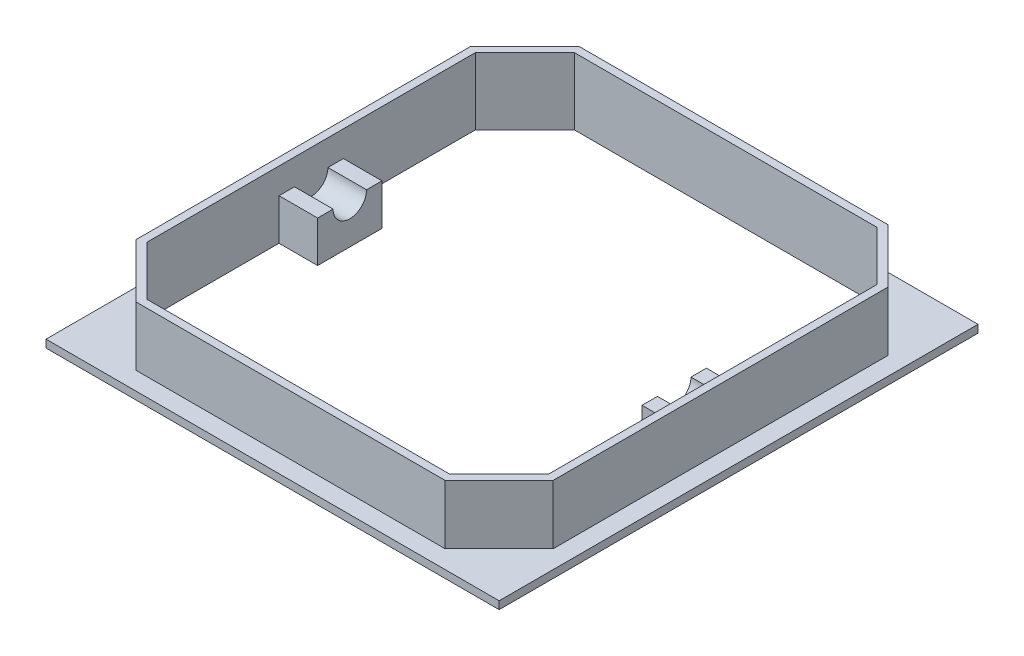
ISO-10303-21;
HEADER;
FILE_DESCRIPTION(('STEP AP214'),'2;1');
FILE_NAME('part.step','',(''),(''),'','','');
FILE_SCHEMA(('AUTOMOTIVE_DESIGN { 1 0 10303 214 1 1 1 1 }'));
ENDSEC;
DATA;
#1=APPLICATION_CONTEXT('core data for automotive mechanical design processes');
#2=APPLICATION_PROTOCOL_DEFINITION('international standard','automotive_design',2000,#1);
#3=PRODUCT_CONTEXT('',#1,'mechanical');
#4=PRODUCT('Part','Part','',(#3));
#5=PRODUCT_RELATED_PRODUCT_CATEGORY('part','',(#4));
#6=PRODUCT_DEFINITION_FORMATION('','',#4);
#7=PRODUCT_DEFINITION_CONTEXT('part definition',#1,'design');
#8=PRODUCT_DEFINITION('design','',#6,#7);
#9=PRODUCT_DEFINITION_SHAPE('','',#8);
#10=(LENGTH_UNIT() NAMED_UNIT(*) SI_UNIT(.MILLI.,.METRE.));
#11=(NAMED_UNIT(*) PLANE_ANGLE_UNIT() SI_UNIT($,.RADIAN.));
#12=(NAMED_UNIT(*) SI_UNIT($,.STERADIAN.) SOLID_ANGLE_UNIT());
#13=UNCERTAINTY_MEASURE_WITH_UNIT(LENGTH_MEASURE(1.E-05),#10,'distance_accuracy_value','');
#14=(GEOMETRIC_REPRESENTATION_CONTEXT(3) GLOBAL_UNCERTAINTY_ASSIGNED_CONTEXT((#13)) GLOBAL_UNIT_ASSIGNED_CONTEXT((#10,
#11,#12)) REPRESENTATION_CONTEXT('',''));
#15=CARTESIAN_POINT('',(0.,0.,0.));
#16=DIRECTION('',(0.,0.,1.));
#17=DIRECTION('',(1.,0.,0.));
#18=AXIS2_PLACEMENT_3D('',#15,#16,#17);
#19=CARTESIAN_POINT('',(-39.,0.,-31.8786796564403));
#20=DIRECTION('',(-1.,0.,0.));
#21=DIRECTION('',(0.,0.,1.));
#22=AXIS2_PLACEMENT_3D('',#19,#20,#21);
#23=PLANE('',#22);
#24=DIRECTION('',(0.,-1.,0.));
#25=VECTOR('',#24,1.);
#26=CARTESIAN_POINT('',(-39.,0.,6.24999999999997));
#27=LINE('',#26,#25);
#28=CARTESIAN_POINT('',(-39.,7.99999999999999,6.25));
#29=VERTEX_POINT('',#28);
#30=CARTESIAN_POINT('',(-39.,0.,6.24999999999997));
#31=VERTEX_POINT('',#30);
#32=EDGE_CURVE('E256',#29,#31,#27,.T.);
#33=ORIENTED_EDGE('',*,*,#32,.F.);
#34=DIRECTION('',(0.,0.,1.));
#35=VECTOR('',#34,1.);
#36=CARTESIAN_POINT('',(-39.,7.99999999999999,6.25));
#37=LINE('',#36,#35);
#38=CARTESIAN_POINT('',(-39.,7.99999999999999,3.25));
#39=VERTEX_POINT('',#38);
#40=EDGE_CURVE('E304',#39,#29,#37,.T.);
#41=ORIENTED_EDGE('',*,*,#40,.F.);
#42=CARTESIAN_POINT('',(-39.,7.99999999999999,0.));
#43=DIRECTION('',(-1.,0.,0.));
#44=DIRECTION('',(0.,0.,-1.));
#45=AXIS2_PLACEMENT_3D('',#42,#43,#44);
#46=CIRCLE('',#45,3.25);
#47=CARTESIAN_POINT('',(-39.,7.99999999999999,-3.25));
#48=VERTEX_POINT('',#47);
#49=EDGE_CURVE('E320',#48,#39,#46,.T.);
#50=ORIENTED_EDGE('',*,*,#49,.F.);
#51=DIRECTION('',(0.,0.,1.));
#52=VECTOR('',#51,1.);
#53=CARTESIAN_POINT('',(-39.,7.99999999999999,-6.25));
#54=LINE('',#53,#52);
#55=CARTESIAN_POINT('',(-39.,7.99999999999999,-6.25));
#56=VERTEX_POINT('',#55);
#57=EDGE_CURVE('E60',#56,#48,#54,.T.);
#58=ORIENTED_EDGE('',*,*,#57,.F.);
#59=DIRECTION('',(0.,1.,0.));
#60=VECTOR('',#59,1.);
#61=CARTESIAN_POINT('',(-39.,0.,-6.25));
#62=LINE('',#61,#60);
#63=CARTESIAN_POINT('',(-39.,0.,-6.25));
#64=VERTEX_POINT('',#63);
#65=EDGE_CURVE('E317',#64,#56,#62,.T.);
#66=ORIENTED_EDGE('',*,*,#65,.F.);
#67=DIRECTION('',(0.,0.,1.));
#68=VECTOR('',#67,1.);
#69=CARTESIAN_POINT('',(-39.,0.,-31.8786796564403));
#70=LINE('',#69,#68);
#71=CARTESIAN_POINT('',(-39.,0.,-31.8786796564403));
#72=VERTEX_POINT('',#71);
#73=EDGE_CURVE('E367',#72,#64,#70,.T.);
#74=ORIENTED_EDGE('',*,*,#73,.F.);
#75=DIRECTION('',(0.,1.,0.));
#76=VECTOR('',#75,1.);
#77=CARTESIAN_POINT('',(-39.,0.,-31.8786796564403));
#78=LINE('',#77,#76);
#79=CARTESIAN_POINT('',(-39.,13.,-31.8786796564403));
#80=VERTEX_POINT('',#79);
#81=EDGE_CURVE('E395',#72,#80,#78,.T.);
#82=ORIENTED_EDGE('',*,*,#81,.T.);
#83=DIRECTION('',(0.,0.,1.));
#84=VECTOR('',#83,1.);
#85=CARTESIAN_POINT('',(-39.,13.,-31.8786796564403));
#86=LINE('',#85,#84);
#87=CARTESIAN_POINT('',(-39.,13.,31.8786796564402));
#88=VERTEX_POINT('',#87);
#89=EDGE_CURVE('E347',#80,#88,#86,.T.);
#90=ORIENTED_EDGE('',*,*,#89,.T.);
#91=DIRECTION('',(0.,1.,0.));
#92=VECTOR('',#91,1.);
#93=CARTESIAN_POINT('',(-39.,0.,31.8786796564402));
#94=LINE('',#93,#92);
#95=CARTESIAN_POINT('',(-39.,0.,31.8786796564402));
#96=VERTEX_POINT('',#95);
#97=EDGE_CURVE('E392',#96,#88,#94,.T.);
#98=ORIENTED_EDGE('',*,*,#97,.F.);
#99=EDGE_CURVE('E366',#31,#96,#70,.T.);
#100=ORIENTED_EDGE('',*,*,#99,.F.);
#101=EDGE_LOOP('',(#33,#41,#50,#58,#66,#74,#82,#90,#98,#100));
#102=FACE_BOUND('',#101,.T.);
#103=ADVANCED_FACE('F37',(#102),#23,.F.);
#104=CARTESIAN_POINT('',(44.,13.,46.5));
#105=DIRECTION('',(-1.,0.,0.));
#106=DIRECTION('',(0.,0.,1.));
#107=AXIS2_PLACEMENT_3D('',#104,#105,#106);
#108=PLANE('',#107);
#109=DIRECTION('',(0.,-1.,0.));
#110=VECTOR('',#109,1.);
#111=CARTESIAN_POINT('',(44.,13.,-46.5));
#112=LINE('',#111,#110);
#113=CARTESIAN_POINT('',(44.,1.5,-46.5));
#114=VERTEX_POINT('',#113);
#115=CARTESIAN_POINT('',(44.,0.,-46.5));
#116=VERTEX_POINT('',#115);
#117=EDGE_CURVE('E12',#114,#116,#112,.T.);
#118=ORIENTED_EDGE('',*,*,#117,.F.);
#119=DIRECTION('',(0.,0.,-1.));
#120=VECTOR('',#119,1.);
#121=CARTESIAN_POINT('',(44.,1.5,-36.5000000000001));
#122=LINE('',#121,#120);
#123=CARTESIAN_POINT('',(44.0000000000002,1.5,46.5));
#124=VERTEX_POINT('',#123);
#125=EDGE_CURVE('E442',#124,#114,#122,.T.);
#126=ORIENTED_EDGE('',*,*,#125,.F.);
#127=DIRECTION('',(0.,-1.,0.));
#128=VECTOR('',#127,1.);
#129=CARTESIAN_POINT('',(44.,13.,46.5));
#130=LINE('',#129,#128);
#131=CARTESIAN_POINT('',(44.,0.,46.5));
#132=VERTEX_POINT('',#131);
#133=EDGE_CURVE('E493',#124,#132,#130,.T.);
#134=ORIENTED_EDGE('',*,*,#133,.T.);
#135=DIRECTION('',(0.,0.,-1.));
#136=VECTOR('',#135,1.);
#137=CARTESIAN_POINT('',(44.,0.,46.5));
#138=LINE('',#137,#136);
#139=EDGE_CURVE('E454',#132,#116,#138,.T.);
#140=ORIENTED_EDGE('',*,*,#139,.T.);
#141=EDGE_LOOP('',(#118,#126,#134,#140));
#142=FACE_BOUND('',#141,.T.);
#143=ADVANCED_FACE('F39',(#142),#108,.F.);
#144=CARTESIAN_POINT('',(-44.,13.,-46.5));
#145=DIRECTION('',(0.,0.,1.));
#146=DIRECTION('',(1.,0.,0.));
#147=AXIS2_PLACEMENT_3D('',#144,#145,#146);
#148=PLANE('',#147);
#149=DIRECTION('',(0.,-1.,0.));
#150=VECTOR('',#149,1.);
#151=CARTESIAN_POINT('',(-44.,13.,-46.5));
#152=LINE('',#151,#150);
#153=CARTESIAN_POINT('',(-44.,1.5,-46.5));
#154=VERTEX_POINT('',#153);
#155=CARTESIAN_POINT('',(-44.,0.,-46.5));
#156=VERTEX_POINT('',#155);
#157=EDGE_CURVE('E45',#154,#156,#152,.T.);
#158=ORIENTED_EDGE('',*,*,#157,.F.);
#159=DIRECTION('',(-1.,0.,0.));
#160=VECTOR('',#159,1.);
#161=CARTESIAN_POINT('',(-44.,1.5,-46.5));
#162=LINE('',#161,#160);
#163=EDGE_CURVE('E444',#114,#154,#162,.T.);
#164=ORIENTED_EDGE('',*,*,#163,.F.);
#165=ORIENTED_EDGE('',*,*,#117,.T.);
#166=DIRECTION('',(-1.,0.,0.));
#167=VECTOR('',#166,1.);
#168=CARTESIAN_POINT('',(-44.,0.,-46.5));
#169=LINE('',#168,#167);
#170=EDGE_CURVE('E484',#116,#156,#169,.T.);
#171=ORIENTED_EDGE('',*,*,#170,.T.);
#172=EDGE_LOOP('',(#158,#164,#165,#171));
#173=FACE_BOUND('',#172,.T.);
#174=ADVANCED_FACE('F506',(#173),#148,.F.);
#175=CARTESIAN_POINT('',(-44.,13.,46.5));
#176=DIRECTION('',(1.,0.,0.));
#177=DIRECTION('',(0.,0.,-1.));
#178=AXIS2_PLACEMENT_3D('',#175,#176,#177);
#179=PLANE('',#178);
#180=DIRECTION('',(0.,-1.,0.));
#181=VECTOR('',#180,1.);
#182=CARTESIAN_POINT('',(-44.,13.,46.5));
#183=LINE('',#182,#181);
#184=CARTESIAN_POINT('',(-44.,1.5,46.5));
#185=VERTEX_POINT('',#184);
#186=CARTESIAN_POINT('',(-44.,0.,46.5));
#187=VERTEX_POINT('',#186);
#188=EDGE_CURVE('E495',#185,#187,#183,.T.);
#189=ORIENTED_EDGE('',*,*,#188,.F.);
#190=DIRECTION('',(0.,0.,1.));
#191=VECTOR('',#190,1.);
#192=CARTESIAN_POINT('',(-44.,1.5,36.5000000000001));
#193=LINE('',#192,#191);
#194=EDGE_CURVE('E468',#154,#185,#193,.T.);
#195=ORIENTED_EDGE('',*,*,#194,.F.);
#196=ORIENTED_EDGE('',*,*,#157,.T.);
#197=DIRECTION('',(0.,0.,1.));
#198=VECTOR('',#197,1.);
#199=CARTESIAN_POINT('',(-44.,0.,46.5));
#200=LINE('',#199,#198);
#201=EDGE_CURVE('E487',#156,#187,#200,.T.);
#202=ORIENTED_EDGE('',*,*,#201,.T.);
#203=EDGE_LOOP('',(#189,#195,#196,#202));
#204=FACE_BOUND('',#203,.T.);
#205=ADVANCED_FACE('F500',(#204),#179,.F.);
#206=CARTESIAN_POINT('',(-44.,13.,46.5));
#207=DIRECTION('',(0.,0.,-1.));
#208=DIRECTION('',(-1.,0.,0.));
#209=AXIS2_PLACEMENT_3D('',#206,#207,#208);
#210=PLANE('',#209);
#211=ORIENTED_EDGE('',*,*,#133,.F.);
#212=DIRECTION('',(1.,0.,0.));
#213=VECTOR('',#212,1.);
#214=CARTESIAN_POINT('',(-44.,1.5,46.5));
#215=LINE('',#214,#213);
#216=EDGE_CURVE('E394',#185,#124,#215,.T.);
#217=ORIENTED_EDGE('',*,*,#216,.F.);
#218=ORIENTED_EDGE('',*,*,#188,.T.);
#219=DIRECTION('',(1.,0.,0.));
#220=VECTOR('',#219,1.);
#221=CARTESIAN_POINT('',(-44.,0.,46.5));
#222=LINE('',#221,#220);
#223=EDGE_CURVE('E490',#187,#132,#222,.T.);
#224=ORIENTED_EDGE('',*,*,#223,.T.);
#225=EDGE_LOOP('',(#211,#217,#218,#224));
#226=FACE_BOUND('',#225,.T.);
#227=ADVANCED_FACE('F513',(#226),#210,.F.);
#228=CARTESIAN_POINT('',(0.,0.,0.));
#229=DIRECTION('',(0.,-1.,0.));
#230=DIRECTION('',(0.,0.,-1.));
#231=AXIS2_PLACEMENT_3D('',#228,#229,#230);
#232=PLANE('',#231);
#233=DIRECTION('',(0.707106781186548,0.,0.707106781186548));
#234=VECTOR('',#233,1.);
#235=CARTESIAN_POINT('',(-39.,0.,31.8786796564402));
#236=LINE('',#235,#234);
#237=CARTESIAN_POINT('',(-29.3786796564402,0.,41.5));
#238=VERTEX_POINT('',#237);
#239=EDGE_CURVE('E343',#96,#238,#236,.T.);
#240=ORIENTED_EDGE('',*,*,#239,.T.);
#241=DIRECTION('',(1.,0.,0.));
#242=VECTOR('',#241,1.);
#243=CARTESIAN_POINT('',(-29.3786796564402,0.,41.5));
#244=LINE('',#243,#242);
#245=CARTESIAN_POINT('',(29.3786796564402,0.,41.5));
#246=VERTEX_POINT('',#245);
#247=EDGE_CURVE('E346',#238,#246,#244,.T.);
#248=ORIENTED_EDGE('',*,*,#247,.T.);
#249=DIRECTION('',(0.707106781186548,0.,-0.707106781186548));
#250=VECTOR('',#249,1.);
#251=CARTESIAN_POINT('',(29.3786796564402,0.,41.5));
#252=LINE('',#251,#250);
#253=CARTESIAN_POINT('',(39.,0.,31.8786796564402));
#254=VERTEX_POINT('',#253);
#255=EDGE_CURVE('E350',#246,#254,#252,.T.);
#256=ORIENTED_EDGE('',*,*,#255,.T.);
#257=DIRECTION('',(0.,0.,-1.));
#258=VECTOR('',#257,1.);
#259=CARTESIAN_POINT('',(39.,0.,31.8786796564402));
#260=LINE('',#259,#258);
#261=CARTESIAN_POINT('',(39.,0.,6.24999999999997));
#262=VERTEX_POINT('',#261);
#263=EDGE_CURVE('E354',#254,#262,#260,.T.);
#264=ORIENTED_EDGE('',*,*,#263,.T.);
#265=DIRECTION('',(1.,0.,0.));
#266=VECTOR('',#265,1.);
#267=CARTESIAN_POINT('',(31.5,0.,6.24999999999997));
#268=LINE('',#267,#266);
#269=CARTESIAN_POINT('',(31.5,0.,6.24999999999997));
#270=VERTEX_POINT('',#269);
#271=EDGE_CURVE('E281',#270,#262,#268,.T.);
#272=ORIENTED_EDGE('',*,*,#271,.F.);
#273=DIRECTION('',(0.,0.,-1.));
#274=VECTOR('',#273,1.);
#275=CARTESIAN_POINT('',(31.5,0.,6.24999999999997));
#276=LINE('',#275,#274);
#277=CARTESIAN_POINT('',(31.5,0.,-6.25));
#278=VERTEX_POINT('',#277);
#279=EDGE_CURVE('E267',#270,#278,#276,.T.);
#280=ORIENTED_EDGE('',*,*,#279,.T.);
#281=DIRECTION('',(1.,0.,0.));
#282=VECTOR('',#281,1.);
#283=CARTESIAN_POINT('',(31.5,0.,-6.25));
#284=LINE('',#283,#282);
#285=CARTESIAN_POINT('',(39.,0.,-6.25));
#286=VERTEX_POINT('',#285);
#287=EDGE_CURVE('E293',#278,#286,#284,.T.);
#288=ORIENTED_EDGE('',*,*,#287,.T.);
#289=CARTESIAN_POINT('',(39.,0.,-31.8786796564403));
#290=VERTEX_POINT('',#289);
#291=EDGE_CURVE('E353',#286,#290,#260,.T.);
#292=ORIENTED_EDGE('',*,*,#291,.T.);
#293=DIRECTION('',(-0.707106781186548,0.,-0.707106781186548));
#294=VECTOR('',#293,1.);
#295=CARTESIAN_POINT('',(39.,0.,-31.8786796564403));
#296=LINE('',#295,#294);
#297=CARTESIAN_POINT('',(29.3786796564402,0.,-41.5000000000001));
#298=VERTEX_POINT('',#297);
#299=EDGE_CURVE('E357',#290,#298,#296,.T.);
#300=ORIENTED_EDGE('',*,*,#299,.T.);
#301=DIRECTION('',(-1.,0.,0.));
#302=VECTOR('',#301,1.);
#303=CARTESIAN_POINT('',(29.3786796564402,0.,-41.5000000000001));
#304=LINE('',#303,#302);
#305=CARTESIAN_POINT('',(-29.3786796564402,0.,-41.5));
#306=VERTEX_POINT('',#305);
#307=EDGE_CURVE('E360',#298,#306,#304,.T.);
#308=ORIENTED_EDGE('',*,*,#307,.T.);
#309=DIRECTION('',(-0.707106781186548,0.,0.707106781186548));
#310=VECTOR('',#309,1.);
#311=CARTESIAN_POINT('',(-29.3786796564402,0.,-41.5));
#312=LINE('',#311,#310);
#313=EDGE_CURVE('E363',#306,#72,#312,.T.);
#314=ORIENTED_EDGE('',*,*,#313,.T.);
#315=ORIENTED_EDGE('',*,*,#73,.T.);
#316=DIRECTION('',(-1.,0.,0.));
#317=VECTOR('',#316,1.);
#318=CARTESIAN_POINT('',(-31.5,0.,-6.25));
#319=LINE('',#318,#317);
#320=CARTESIAN_POINT('',(-31.5,0.,-6.25));
#321=VERTEX_POINT('',#320);
#322=EDGE_CURVE('E336',#321,#64,#319,.T.);
#323=ORIENTED_EDGE('',*,*,#322,.F.);
#324=DIRECTION('',(0.,0.,-1.));
#325=VECTOR('',#324,1.);
#326=CARTESIAN_POINT('',(-31.5,0.,6.24999999999997));
#327=LINE('',#326,#325);
#328=CARTESIAN_POINT('',(-31.5,0.,6.24999999999997));
#329=VERTEX_POINT('',#328);
#330=EDGE_CURVE('E303',#329,#321,#327,.T.);
#331=ORIENTED_EDGE('',*,*,#330,.F.);
#332=DIRECTION('',(-1.,0.,0.));
#333=VECTOR('',#332,1.);
#334=CARTESIAN_POINT('',(-31.5,0.,6.24999999999997));
#335=LINE('',#334,#333);
#336=EDGE_CURVE('E339',#329,#31,#335,.T.);
#337=ORIENTED_EDGE('',*,*,#336,.T.);
#338=ORIENTED_EDGE('',*,*,#99,.T.);
#339=EDGE_LOOP('',(#240,#248,#256,#264,#272,#280,#288,#292,#300,#308,#314,#315,#323,#331,#337,#338));
#340=FACE_BOUND('',#339,.T.);
#341=ORIENTED_EDGE('',*,*,#139,.F.);
#342=ORIENTED_EDGE('',*,*,#223,.F.);
#343=ORIENTED_EDGE('',*,*,#201,.F.);
#344=ORIENTED_EDGE('',*,*,#170,.F.);
#345=EDGE_LOOP('',(#341,#342,#343,#344));
#346=FACE_BOUND('',#345,.T.);
#347=ADVANCED_FACE('F510',(#340,#346),#232,.T.);
#348=CARTESIAN_POINT('',(-29.9999999999999,-128.035151423349,43.));
#349=DIRECTION('',(0.,0.,1.));
#350=DIRECTION('',(1.,0.,0.));
#351=AXIS2_PLACEMENT_3D('',#348,#349,#350);
#352=PLANE('',#351);
#353=DIRECTION('',(1.,0.,0.));
#354=VECTOR('',#353,1.);
#355=CARTESIAN_POINT('',(-29.9999999999999,1.5,43.));
#356=LINE('',#355,#354);
#357=CARTESIAN_POINT('',(-29.9999999999999,1.5,43.));
#358=VERTEX_POINT('',#357);
#359=CARTESIAN_POINT('',(29.9999999999999,1.5,43.));
#360=VERTEX_POINT('',#359);
#361=EDGE_CURVE('E445',#358,#360,#356,.T.);
#362=ORIENTED_EDGE('',*,*,#361,.T.);
#363=DIRECTION('',(0.,1.,0.));
#364=VECTOR('',#363,1.);
#365=CARTESIAN_POINT('',(29.9999999999999,-128.035151423349,43.));
#366=LINE('',#365,#364);
#367=CARTESIAN_POINT('',(29.9999999999999,13.,43.));
#368=VERTEX_POINT('',#367);
#369=EDGE_CURVE('E433',#360,#368,#366,.T.);
#370=ORIENTED_EDGE('',*,*,#369,.T.);
#371=DIRECTION('',(1.,0.,0.));
#372=VECTOR('',#371,1.);
#373=CARTESIAN_POINT('',(-29.9999999999999,13.,43.));
#374=LINE('',#373,#372);
#375=CARTESIAN_POINT('',(-29.9999999999999,13.,43.));
#376=VERTEX_POINT('',#375);
#377=EDGE_CURVE('E438',#376,#368,#374,.T.);
#378=ORIENTED_EDGE('',*,*,#377,.F.);
#379=DIRECTION('',(0.,1.,0.));
#380=VECTOR('',#379,1.);
#381=CARTESIAN_POINT('',(-29.9999999999999,-128.035151423349,43.));
#382=LINE('',#381,#380);
#383=EDGE_CURVE('E441',#358,#376,#382,.T.);
#384=ORIENTED_EDGE('',*,*,#383,.F.);
#385=EDGE_LOOP('',(#362,#370,#378,#384));
#386=FACE_BOUND('',#385,.T.);
#387=ADVANCED_FACE('F590',(#386),#352,.T.);
#388=CARTESIAN_POINT('',(-29.9999999999999,-128.035151423349,43.));
#389=DIRECTION('',(-0.707106781186543,0.,0.707106781186552));
#390=DIRECTION('',(0.707106781186552,0.,0.707106781186543));
#391=AXIS2_PLACEMENT_3D('',#388,#389,#390);
#392=PLANE('',#391);
#393=DIRECTION('',(0.707106781186552,0.,0.707106781186543));
#394=VECTOR('',#393,1.);
#395=CARTESIAN_POINT('',(-29.9999999999999,1.5,43.));
#396=LINE('',#395,#394);
#397=CARTESIAN_POINT('',(-40.5,1.5,32.5));
#398=VERTEX_POINT('',#397);
#399=EDGE_CURVE('E437',#398,#358,#396,.T.);
#400=ORIENTED_EDGE('',*,*,#399,.T.);
#401=ORIENTED_EDGE('',*,*,#383,.T.);
#402=DIRECTION('',(0.707106781186552,0.,0.707106781186543));
#403=VECTOR('',#402,1.);
#404=CARTESIAN_POINT('',(-29.9999999999999,13.,43.));
#405=LINE('',#404,#403);
#406=CARTESIAN_POINT('',(-40.5,13.,32.5));
#407=VERTEX_POINT('',#406);
#408=EDGE_CURVE('E409',#407,#376,#405,.T.);
#409=ORIENTED_EDGE('',*,*,#408,.F.);
#410=DIRECTION('',(0.,1.,0.));
#411=VECTOR('',#410,1.);
#412=CARTESIAN_POINT('',(-40.5,-128.035151423349,32.5));
#413=LINE('',#412,#411);
#414=EDGE_CURVE('E413',#398,#407,#413,.T.);
#415=ORIENTED_EDGE('',*,*,#414,.F.);
#416=EDGE_LOOP('',(#400,#401,#409,#415));
#417=FACE_BOUND('',#416,.T.);
#418=ADVANCED_FACE('F586',(#417),#392,.T.);
#419=CARTESIAN_POINT('',(-40.5,-128.035151423349,32.5));
#420=DIRECTION('',(-1.,0.,0.));
#421=DIRECTION('',(0.,0.,1.));
#422=AXIS2_PLACEMENT_3D('',#419,#420,#421);
#423=PLANE('',#422);
#424=DIRECTION('',(0.,0.,1.));
#425=VECTOR('',#424,1.);
#426=CARTESIAN_POINT('',(-40.5,1.5,32.5));
#427=LINE('',#426,#425);
#428=CARTESIAN_POINT('',(-40.5,1.5,-32.5));
#429=VERTEX_POINT('',#428);
#430=EDGE_CURVE('E451',#429,#398,#427,.T.);
#431=ORIENTED_EDGE('',*,*,#430,.T.);
#432=ORIENTED_EDGE('',*,*,#414,.T.);
#433=DIRECTION('',(0.,0.,1.));
#434=VECTOR('',#433,1.);
#435=CARTESIAN_POINT('',(-40.5,13.,32.5));
#436=LINE('',#435,#434);
#437=CARTESIAN_POINT('',(-40.5,13.,-32.5));
#438=VERTEX_POINT('',#437);
#439=EDGE_CURVE('E414',#438,#407,#436,.T.);
#440=ORIENTED_EDGE('',*,*,#439,.F.);
#441=DIRECTION('',(0.,1.,0.));
#442=VECTOR('',#441,1.);
#443=CARTESIAN_POINT('',(-40.5,-128.035151423349,-32.5));
#444=LINE('',#443,#442);
#445=EDGE_CURVE('E412',#429,#438,#444,.T.);
#446=ORIENTED_EDGE('',*,*,#445,.F.);
#447=EDGE_LOOP('',(#431,#432,#440,#446));
#448=FACE_BOUND('',#447,.T.);
#449=ADVANCED_FACE('F582',(#448),#423,.T.);
#450=CARTESIAN_POINT('',(-29.9999999999999,-128.035151423349,-43.));
#451=DIRECTION('',(-0.707106781186543,0.,-0.707106781186552));
#452=DIRECTION('',(-0.707106781186552,0.,0.707106781186543));
#453=AXIS2_PLACEMENT_3D('',#450,#451,#452);
#454=PLANE('',#453);
#455=DIRECTION('',(-0.707106781186552,0.,0.707106781186543));
#456=VECTOR('',#455,1.);
#457=CARTESIAN_POINT('',(-29.9999999999999,1.5,-43.));
#458=LINE('',#457,#456);
#459=CARTESIAN_POINT('',(-29.9999999999999,1.5,-43.));
#460=VERTEX_POINT('',#459);
#461=EDGE_CURVE('E455',#460,#429,#458,.T.);
#462=ORIENTED_EDGE('',*,*,#461,.T.);
#463=ORIENTED_EDGE('',*,*,#445,.T.);
#464=DIRECTION('',(-0.707106781186552,0.,0.707106781186543));
#465=VECTOR('',#464,1.);
#466=CARTESIAN_POINT('',(-29.9999999999999,13.,-43.));
#467=LINE('',#466,#465);
#468=CARTESIAN_POINT('',(-29.9999999999999,13.,-43.));
#469=VERTEX_POINT('',#468);
#470=EDGE_CURVE('E418',#469,#438,#467,.T.);
#471=ORIENTED_EDGE('',*,*,#470,.F.);
#472=DIRECTION('',(0.,1.,0.));
#473=VECTOR('',#472,1.);
#474=CARTESIAN_POINT('',(-29.9999999999999,-128.035151423349,-43.));
#475=LINE('',#474,#473);
#476=EDGE_CURVE('E417',#460,#469,#475,.T.);
#477=ORIENTED_EDGE('',*,*,#476,.F.);
#478=EDGE_LOOP('',(#462,#463,#471,#477));
#479=FACE_BOUND('',#478,.T.);
#480=ADVANCED_FACE('F578',(#479),#454,.T.);
#481=CARTESIAN_POINT('',(-29.9999999999999,-128.035151423349,-43.));
#482=DIRECTION('',(0.,0.,-1.));
#483=DIRECTION('',(-1.,0.,0.));
#484=AXIS2_PLACEMENT_3D('',#481,#482,#483);
#485=PLANE('',#484);
#486=DIRECTION('',(-1.,0.,0.));
#487=VECTOR('',#486,1.);
#488=CARTESIAN_POINT('',(-29.9999999999999,1.5,-43.));
#489=LINE('',#488,#487);
#490=CARTESIAN_POINT('',(29.9999999999999,1.5,-43.));
#491=VERTEX_POINT('',#490);
#492=EDGE_CURVE('E458',#491,#460,#489,.T.);
#493=ORIENTED_EDGE('',*,*,#492,.T.);
#494=ORIENTED_EDGE('',*,*,#476,.T.);
#495=DIRECTION('',(-1.,0.,0.));
#496=VECTOR('',#495,1.);
#497=CARTESIAN_POINT('',(-29.9999999999999,13.,-43.));
#498=LINE('',#497,#496);
#499=CARTESIAN_POINT('',(29.9999999999999,13.,-43.));
#500=VERTEX_POINT('',#499);
#501=EDGE_CURVE('E422',#500,#469,#498,.T.);
#502=ORIENTED_EDGE('',*,*,#501,.F.);
#503=DIRECTION('',(0.,1.,0.));
#504=VECTOR('',#503,1.);
#505=CARTESIAN_POINT('',(29.9999999999999,-128.035151423349,-43.));
#506=LINE('',#505,#504);
#507=EDGE_CURVE('E421',#491,#500,#506,.T.);
#508=ORIENTED_EDGE('',*,*,#507,.F.);
#509=EDGE_LOOP('',(#493,#494,#502,#508));
#510=FACE_BOUND('',#509,.T.);
#511=ADVANCED_FACE('F574',(#510),#485,.T.);
#512=CARTESIAN_POINT('',(29.9999999999999,-128.035151423349,-43.));
#513=DIRECTION('',(0.707106781186543,0.,-0.707106781186552));
#514=DIRECTION('',(-0.707106781186552,0.,-0.707106781186543));
#515=AXIS2_PLACEMENT_3D('',#512,#513,#514);
#516=PLANE('',#515);
#517=DIRECTION('',(-0.707106781186552,0.,-0.707106781186543));
#518=VECTOR('',#517,1.);
#519=CARTESIAN_POINT('',(29.9999999999999,1.5,-43.));
#520=LINE('',#519,#518);
#521=CARTESIAN_POINT('',(40.5,1.5,-32.5));
#522=VERTEX_POINT('',#521);
#523=EDGE_CURVE('E461',#522,#491,#520,.T.);
#524=ORIENTED_EDGE('',*,*,#523,.T.);
#525=ORIENTED_EDGE('',*,*,#507,.T.);
#526=DIRECTION('',(-0.707106781186552,0.,-0.707106781186543));
#527=VECTOR('',#526,1.);
#528=CARTESIAN_POINT('',(29.9999999999999,13.,-43.));
#529=LINE('',#528,#527);
#530=CARTESIAN_POINT('',(40.5,13.,-32.5));
#531=VERTEX_POINT('',#530);
#532=EDGE_CURVE('E426',#531,#500,#529,.T.);
#533=ORIENTED_EDGE('',*,*,#532,.F.);
#534=DIRECTION('',(0.,1.,0.));
#535=VECTOR('',#534,1.);
#536=CARTESIAN_POINT('',(40.5,-128.035151423349,-32.5));
#537=LINE('',#536,#535);
#538=EDGE_CURVE('E425',#522,#531,#537,.T.);
#539=ORIENTED_EDGE('',*,*,#538,.F.);
#540=EDGE_LOOP('',(#524,#525,#533,#539));
#541=FACE_BOUND('',#540,.T.);
#542=ADVANCED_FACE('F570',(#541),#516,.T.);
#543=CARTESIAN_POINT('',(40.5,-128.035151423349,32.5));
#544=DIRECTION('',(1.,0.,0.));
#545=DIRECTION('',(0.,0.,-1.));
#546=AXIS2_PLACEMENT_3D('',#543,#544,#545);
#547=PLANE('',#546);
#548=DIRECTION('',(0.,0.,-1.));
#549=VECTOR('',#548,1.);
#550=CARTESIAN_POINT('',(40.5,1.5,32.5));
#551=LINE('',#550,#549);
#552=CARTESIAN_POINT('',(40.5,1.5,32.5));
#553=VERTEX_POINT('',#552);
#554=EDGE_CURVE('E464',#553,#522,#551,.T.);
#555=ORIENTED_EDGE('',*,*,#554,.T.);
#556=ORIENTED_EDGE('',*,*,#538,.T.);
#557=DIRECTION('',(0.,0.,-1.));
#558=VECTOR('',#557,1.);
#559=CARTESIAN_POINT('',(40.5,13.,32.5));
#560=LINE('',#559,#558);
#561=CARTESIAN_POINT('',(40.5,13.,32.5));
#562=VERTEX_POINT('',#561);
#563=EDGE_CURVE('E430',#562,#531,#560,.T.);
#564=ORIENTED_EDGE('',*,*,#563,.F.);
#565=DIRECTION('',(0.,1.,0.));
#566=VECTOR('',#565,1.);
#567=CARTESIAN_POINT('',(40.5,-128.035151423349,32.5));
#568=LINE('',#567,#566);
#569=EDGE_CURVE('E429',#553,#562,#568,.T.);
#570=ORIENTED_EDGE('',*,*,#569,.F.);
#571=EDGE_LOOP('',(#555,#556,#564,#570));
#572=FACE_BOUND('',#571,.T.);
#573=ADVANCED_FACE('F566',(#572),#547,.T.);
#574=CARTESIAN_POINT('',(29.9999999999999,-128.035151423349,43.));
#575=DIRECTION('',(0.707106781186544,0.,0.707106781186551));
#576=DIRECTION('',(0.707106781186551,0.,-0.707106781186544));
#577=AXIS2_PLACEMENT_3D('',#574,#575,#576);
#578=PLANE('',#577);
#579=DIRECTION('',(0.707106781186551,0.,-0.707106781186544));
#580=VECTOR('',#579,1.);
#581=CARTESIAN_POINT('',(29.9999999999999,1.5,43.));
#582=LINE('',#581,#580);
#583=EDGE_CURVE('E448',#360,#553,#582,.T.);
#584=ORIENTED_EDGE('',*,*,#583,.T.);
#585=ORIENTED_EDGE('',*,*,#569,.T.);
#586=DIRECTION('',(0.707106781186551,0.,-0.707106781186544));
#587=VECTOR('',#586,1.);
#588=CARTESIAN_POINT('',(29.9999999999999,13.,43.));
#589=LINE('',#588,#587);
#590=EDGE_CURVE('E434',#368,#562,#589,.T.);
#591=ORIENTED_EDGE('',*,*,#590,.F.);
#592=ORIENTED_EDGE('',*,*,#369,.F.);
#593=EDGE_LOOP('',(#584,#585,#591,#592));
#594=FACE_BOUND('',#593,.T.);
#595=ADVANCED_FACE('F563',(#594),#578,.T.);
#596=CARTESIAN_POINT('',(0.,1.5,0.));
#597=DIRECTION('',(0.,-1.,0.));
#598=DIRECTION('',(0.,0.,-1.));
#599=AXIS2_PLACEMENT_3D('',#596,#597,#598);
#600=PLANE('',#599);
#601=ORIENTED_EDGE('',*,*,#216,.T.);
#602=ORIENTED_EDGE('',*,*,#125,.T.);
#603=ORIENTED_EDGE('',*,*,#163,.T.);
#604=ORIENTED_EDGE('',*,*,#194,.T.);
#605=EDGE_LOOP('',(#601,#602,#603,#604));
#606=FACE_BOUND('',#605,.T.);
#607=ORIENTED_EDGE('',*,*,#399,.F.);
#608=ORIENTED_EDGE('',*,*,#430,.F.);
#609=ORIENTED_EDGE('',*,*,#461,.F.);
#610=ORIENTED_EDGE('',*,*,#492,.F.);
#611=ORIENTED_EDGE('',*,*,#523,.F.);
#612=ORIENTED_EDGE('',*,*,#554,.F.);
#613=ORIENTED_EDGE('',*,*,#583,.F.);
#614=ORIENTED_EDGE('',*,*,#361,.F.);
#615=EDGE_LOOP('',(#607,#608,#609,#610,#611,#612,#613,#614));
#616=FACE_BOUND('',#615,.T.);
#617=ADVANCED_FACE('F517',(#606,#616),#600,.F.);
#618=CARTESIAN_POINT('',(0.,13.,0.));
#619=DIRECTION('',(0.,-1.,0.));
#620=DIRECTION('',(0.,0.,-1.));
#621=AXIS2_PLACEMENT_3D('',#618,#619,#620);
#622=PLANE('',#621);
#623=DIRECTION('',(1.,0.,0.));
#624=VECTOR('',#623,1.);
#625=CARTESIAN_POINT('',(-29.3786796564402,13.,41.5));
#626=LINE('',#625,#624);
#627=CARTESIAN_POINT('',(-29.3786796564402,13.,41.5));
#628=VERTEX_POINT('',#627);
#629=CARTESIAN_POINT('',(29.3786796564402,13.,41.5));
#630=VERTEX_POINT('',#629);
#631=EDGE_CURVE('E372',#628,#630,#626,.T.);
#632=ORIENTED_EDGE('',*,*,#631,.F.);
#633=DIRECTION('',(0.707106781186548,0.,0.707106781186548));
#634=VECTOR('',#633,1.);
#635=CARTESIAN_POINT('',(-39.,13.,31.8786796564402));
#636=LINE('',#635,#634);
#637=EDGE_CURVE('E342',#88,#628,#636,.T.);
#638=ORIENTED_EDGE('',*,*,#637,.F.);
#639=ORIENTED_EDGE('',*,*,#89,.F.);
#640=DIRECTION('',(-0.707106781186548,0.,0.707106781186548));
#641=VECTOR('',#640,1.);
#642=CARTESIAN_POINT('',(-29.3786796564402,13.,-41.5));
#643=LINE('',#642,#641);
#644=CARTESIAN_POINT('',(-29.3786796564402,13.,-41.5));
#645=VERTEX_POINT('',#644);
#646=EDGE_CURVE('E387',#645,#80,#643,.T.);
#647=ORIENTED_EDGE('',*,*,#646,.F.);
#648=DIRECTION('',(-1.,0.,0.));
#649=VECTOR('',#648,1.);
#650=CARTESIAN_POINT('',(29.3786796564402,13.,-41.5000000000001));
#651=LINE('',#650,#649);
#652=CARTESIAN_POINT('',(29.3786796564402,13.,-41.5000000000001));
#653=VERTEX_POINT('',#652);
#654=EDGE_CURVE('E384',#653,#645,#651,.T.);
#655=ORIENTED_EDGE('',*,*,#654,.F.);
#656=DIRECTION('',(-0.707106781186548,0.,-0.707106781186548));
#657=VECTOR('',#656,1.);
#658=CARTESIAN_POINT('',(39.,13.,-31.8786796564403));
#659=LINE('',#658,#657);
#660=CARTESIAN_POINT('',(39.,13.,-31.8786796564403));
#661=VERTEX_POINT('',#660);
#662=EDGE_CURVE('E381',#661,#653,#659,.T.);
#663=ORIENTED_EDGE('',*,*,#662,.F.);
#664=DIRECTION('',(0.,0.,-1.));
#665=VECTOR('',#664,1.);
#666=CARTESIAN_POINT('',(39.,13.,31.8786796564402));
#667=LINE('',#666,#665);
#668=CARTESIAN_POINT('',(39.,13.,31.8786796564402));
#669=VERTEX_POINT('',#668);
#670=EDGE_CURVE('E378',#669,#661,#667,.T.);
#671=ORIENTED_EDGE('',*,*,#670,.F.);
#672=DIRECTION('',(0.707106781186548,0.,-0.707106781186548));
#673=VECTOR('',#672,1.);
#674=CARTESIAN_POINT('',(29.3786796564402,13.,41.5));
#675=LINE('',#674,#673);
#676=EDGE_CURVE('E375',#630,#669,#675,.T.);
#677=ORIENTED_EDGE('',*,*,#676,.F.);
#678=EDGE_LOOP('',(#632,#638,#639,#647,#655,#663,#671,#677));
#679=FACE_BOUND('',#678,.T.);
#680=ORIENTED_EDGE('',*,*,#377,.T.);
#681=ORIENTED_EDGE('',*,*,#590,.T.);
#682=ORIENTED_EDGE('',*,*,#563,.T.);
#683=ORIENTED_EDGE('',*,*,#532,.T.);
#684=ORIENTED_EDGE('',*,*,#501,.T.);
#685=ORIENTED_EDGE('',*,*,#470,.T.);
#686=ORIENTED_EDGE('',*,*,#439,.T.);
#687=ORIENTED_EDGE('',*,*,#408,.T.);
#688=EDGE_LOOP('',(#680,#681,#682,#683,#684,#685,#686,#687));
#689=FACE_BOUND('',#688,.T.);
#690=ADVANCED_FACE('F561',(#679,#689),#622,.F.);
#691=CARTESIAN_POINT('',(-39.,0.,31.8786796564402));
#692=DIRECTION('',(-0.707106781186548,0.,0.707106781186548));
#693=DIRECTION('',(0.707106781186548,0.,0.707106781186548));
#694=AXIS2_PLACEMENT_3D('',#691,#692,#693);
#695=PLANE('',#694);
#696=ORIENTED_EDGE('',*,*,#637,.T.);
#697=DIRECTION('',(0.,1.,0.));
#698=VECTOR('',#697,1.);
#699=CARTESIAN_POINT('',(-29.3786796564402,0.,41.5));
#700=LINE('',#699,#698);
#701=EDGE_CURVE('E370',#238,#628,#700,.T.);
#702=ORIENTED_EDGE('',*,*,#701,.F.);
#703=ORIENTED_EDGE('',*,*,#239,.F.);
#704=ORIENTED_EDGE('',*,*,#97,.T.);
#705=EDGE_LOOP('',(#696,#702,#703,#704));
#706=FACE_BOUND('',#705,.T.);
#707=ADVANCED_FACE('F538',(#706),#695,.F.);
#708=CARTESIAN_POINT('',(-29.3786796564402,0.,-41.5));
#709=DIRECTION('',(-0.707106781186548,0.,-0.707106781186548));
#710=DIRECTION('',(-0.707106781186548,0.,0.707106781186548));
#711=AXIS2_PLACEMENT_3D('',#708,#709,#710);
#712=PLANE('',#711);
#713=ORIENTED_EDGE('',*,*,#646,.T.);
#714=ORIENTED_EDGE('',*,*,#81,.F.);
#715=ORIENTED_EDGE('',*,*,#313,.F.);
#716=DIRECTION('',(0.,1.,0.));
#717=VECTOR('',#716,1.);
#718=CARTESIAN_POINT('',(-29.3786796564402,0.,-41.5));
#719=LINE('',#718,#717);
#720=EDGE_CURVE('E397',#306,#645,#719,.T.);
#721=ORIENTED_EDGE('',*,*,#720,.T.);
#722=EDGE_LOOP('',(#713,#714,#715,#721));
#723=FACE_BOUND('',#722,.T.);
#724=ADVANCED_FACE('F534',(#723),#712,.F.);
#725=CARTESIAN_POINT('',(29.3786796564402,0.,-41.5000000000001));
#726=DIRECTION('',(0.,0.,-1.));
#727=DIRECTION('',(-1.,0.,0.));
#728=AXIS2_PLACEMENT_3D('',#725,#726,#727);
#729=PLANE('',#728);
#730=ORIENTED_EDGE('',*,*,#654,.T.);
#731=ORIENTED_EDGE('',*,*,#720,.F.);
#732=ORIENTED_EDGE('',*,*,#307,.F.);
#733=DIRECTION('',(0.,1.,0.));
#734=VECTOR('',#733,1.);
#735=CARTESIAN_POINT('',(29.3786796564402,0.,-41.5000000000001));
#736=LINE('',#735,#734);
#737=EDGE_CURVE('E399',#298,#653,#736,.T.);
#738=ORIENTED_EDGE('',*,*,#737,.T.);
#739=EDGE_LOOP('',(#730,#731,#732,#738));
#740=FACE_BOUND('',#739,.T.);
#741=ADVANCED_FACE('F537',(#740),#729,.F.);
#742=CARTESIAN_POINT('',(39.,0.,-31.8786796564403));
#743=DIRECTION('',(0.707106781186548,0.,-0.707106781186548));
#744=DIRECTION('',(-0.707106781186548,0.,-0.707106781186548));
#745=AXIS2_PLACEMENT_3D('',#742,#743,#744);
#746=PLANE('',#745);
#747=ORIENTED_EDGE('',*,*,#662,.T.);
#748=ORIENTED_EDGE('',*,*,#737,.F.);
#749=ORIENTED_EDGE('',*,*,#299,.F.);
#750=DIRECTION('',(0.,1.,0.));
#751=VECTOR('',#750,1.);
#752=CARTESIAN_POINT('',(39.,0.,-31.8786796564403));
#753=LINE('',#752,#751);
#754=EDGE_CURVE('E401',#290,#661,#753,.T.);
#755=ORIENTED_EDGE('',*,*,#754,.T.);
#756=EDGE_LOOP('',(#747,#748,#749,#755));
#757=FACE_BOUND('',#756,.T.);
#758=ADVANCED_FACE('F542',(#757),#746,.F.);
#759=CARTESIAN_POINT('',(39.,0.,31.8786796564402));
#760=DIRECTION('',(1.,0.,0.));
#761=DIRECTION('',(0.,0.,-1.));
#762=AXIS2_PLACEMENT_3D('',#759,#760,#761);
#763=PLANE('',#762);
#764=DIRECTION('',(0.,0.,1.));
#765=VECTOR('',#764,1.);
#766=CARTESIAN_POINT('',(39.,7.99999999999999,6.25));
#767=LINE('',#766,#765);
#768=CARTESIAN_POINT('',(39.,7.99999999999999,3.25));
#769=VERTEX_POINT('',#768);
#770=CARTESIAN_POINT('',(39.,7.99999999999999,6.25));
#771=VERTEX_POINT('',#770);
#772=EDGE_CURVE('E283',#769,#771,#767,.T.);
#773=ORIENTED_EDGE('',*,*,#772,.T.);
#774=DIRECTION('',(0.,-1.,0.));
#775=VECTOR('',#774,1.);
#776=CARTESIAN_POINT('',(39.,0.,6.24999999999997));
#777=LINE('',#776,#775);
#778=EDGE_CURVE('E251',#771,#262,#777,.T.);
#779=ORIENTED_EDGE('',*,*,#778,.T.);
#780=ORIENTED_EDGE('',*,*,#263,.F.);
#781=DIRECTION('',(0.,1.,0.));
#782=VECTOR('',#781,1.);
#783=CARTESIAN_POINT('',(39.,0.,31.8786796564402));
#784=LINE('',#783,#782);
#785=EDGE_CURVE('E403',#254,#669,#784,.T.);
#786=ORIENTED_EDGE('',*,*,#785,.T.);
#787=ORIENTED_EDGE('',*,*,#670,.T.);
#788=ORIENTED_EDGE('',*,*,#754,.F.);
#789=ORIENTED_EDGE('',*,*,#291,.F.);
#790=DIRECTION('',(0.,1.,0.));
#791=VECTOR('',#790,1.);
#792=CARTESIAN_POINT('',(39.,0.,-6.25));
#793=LINE('',#792,#791);
#794=CARTESIAN_POINT('',(39.,7.99999999999999,-6.25));
#795=VERTEX_POINT('',#794);
#796=EDGE_CURVE('E52',#286,#795,#793,.T.);
#797=ORIENTED_EDGE('',*,*,#796,.T.);
#798=DIRECTION('',(0.,0.,1.));
#799=VECTOR('',#798,1.);
#800=CARTESIAN_POINT('',(39.,7.99999999999999,-6.25));
#801=LINE('',#800,#799);
#802=CARTESIAN_POINT('',(39.,7.99999999999999,-3.25));
#803=VERTEX_POINT('',#802);
#804=EDGE_CURVE('E288',#795,#803,#801,.T.);
#805=ORIENTED_EDGE('',*,*,#804,.T.);
#806=CARTESIAN_POINT('',(39.,7.99999999999999,0.));
#807=DIRECTION('',(-1.,0.,0.));
#808=DIRECTION('',(0.,0.,-1.));
#809=AXIS2_PLACEMENT_3D('',#806,#807,#808);
#810=CIRCLE('',#809,3.25);
#811=EDGE_CURVE('E285',#803,#769,#810,.T.);
#812=ORIENTED_EDGE('',*,*,#811,.T.);
#813=EDGE_LOOP('',(#773,#779,#780,#786,#787,#788,#789,#797,#805,#812));
#814=FACE_BOUND('',#813,.T.);
#815=ADVANCED_FACE('F546',(#814),#763,.F.);
#816=CARTESIAN_POINT('',(29.3786796564402,0.,41.5));
#817=DIRECTION('',(0.707106781186548,0.,0.707106781186548));
#818=DIRECTION('',(0.707106781186548,0.,-0.707106781186548));
#819=AXIS2_PLACEMENT_3D('',#816,#817,#818);
#820=PLANE('',#819);
#821=ORIENTED_EDGE('',*,*,#676,.T.);
#822=ORIENTED_EDGE('',*,*,#785,.F.);
#823=ORIENTED_EDGE('',*,*,#255,.F.);
#824=DIRECTION('',(0.,1.,0.));
#825=VECTOR('',#824,1.);
#826=CARTESIAN_POINT('',(29.3786796564402,0.,41.5));
#827=LINE('',#826,#825);
#828=EDGE_CURVE('E405',#246,#630,#827,.T.);
#829=ORIENTED_EDGE('',*,*,#828,.T.);
#830=EDGE_LOOP('',(#821,#822,#823,#829));
#831=FACE_BOUND('',#830,.T.);
#832=ADVANCED_FACE('F550',(#831),#820,.F.);
#833=CARTESIAN_POINT('',(-29.3786796564402,0.,41.5));
#834=DIRECTION('',(0.,0.,1.));
#835=DIRECTION('',(1.,0.,0.));
#836=AXIS2_PLACEMENT_3D('',#833,#834,#835);
#837=PLANE('',#836);
#838=ORIENTED_EDGE('',*,*,#631,.T.);
#839=ORIENTED_EDGE('',*,*,#828,.F.);
#840=ORIENTED_EDGE('',*,*,#247,.F.);
#841=ORIENTED_EDGE('',*,*,#701,.T.);
#842=EDGE_LOOP('',(#838,#839,#840,#841));
#843=FACE_BOUND('',#842,.T.);
#844=ADVANCED_FACE('F554',(#843),#837,.F.);
#845=CARTESIAN_POINT('',(-31.5,0.,6.24999999999997));
#846=DIRECTION('',(0.,0.,-1.));
#847=DIRECTION('',(0.,1.,0.));
#848=AXIS2_PLACEMENT_3D('',#845,#846,#847);
#849=PLANE('',#848);
#850=ORIENTED_EDGE('',*,*,#32,.T.);
#851=ORIENTED_EDGE('',*,*,#336,.F.);
#852=DIRECTION('',(0.,-1.,0.));
#853=VECTOR('',#852,1.);
#854=CARTESIAN_POINT('',(-31.5,0.,6.24999999999997));
#855=LINE('',#854,#853);
#856=CARTESIAN_POINT('',(-31.5,7.99999999999999,6.25));
#857=VERTEX_POINT('',#856);
#858=EDGE_CURVE('E300',#857,#329,#855,.T.);
#859=ORIENTED_EDGE('',*,*,#858,.F.);
#860=DIRECTION('',(-1.,0.,0.));
#861=VECTOR('',#860,1.);
#862=CARTESIAN_POINT('',(-31.5,7.99999999999999,6.25));
#863=LINE('',#862,#861);
#864=EDGE_CURVE('E314',#857,#29,#863,.T.);
#865=ORIENTED_EDGE('',*,*,#864,.T.);
#866=EDGE_LOOP('',(#850,#851,#859,#865));
#867=FACE_BOUND('',#866,.T.);
#868=ADVANCED_FACE('F532',(#867),#849,.F.);
#869=CARTESIAN_POINT('',(-31.5,0.,-6.25));
#870=DIRECTION('',(0.,0.,1.));
#871=DIRECTION('',(1.,0.,0.));
#872=AXIS2_PLACEMENT_3D('',#869,#870,#871);
#873=PLANE('',#872);
#874=ORIENTED_EDGE('',*,*,#65,.T.);
#875=DIRECTION('',(-1.,0.,0.));
#876=VECTOR('',#875,1.);
#877=CARTESIAN_POINT('',(-31.5,7.99999999999999,-6.25));
#878=LINE('',#877,#876);
#879=CARTESIAN_POINT('',(-31.5,7.99999999999999,-6.25));
#880=VERTEX_POINT('',#879);
#881=EDGE_CURVE('E333',#880,#56,#878,.T.);
#882=ORIENTED_EDGE('',*,*,#881,.F.);
#883=DIRECTION('',(0.,1.,0.));
#884=VECTOR('',#883,1.);
#885=CARTESIAN_POINT('',(-31.5,0.,-6.25));
#886=LINE('',#885,#884);
#887=EDGE_CURVE('E306',#321,#880,#886,.T.);
#888=ORIENTED_EDGE('',*,*,#887,.F.);
#889=ORIENTED_EDGE('',*,*,#322,.T.);
#890=EDGE_LOOP('',(#874,#882,#888,#889));
#891=FACE_BOUND('',#890,.T.);
#892=ADVANCED_FACE('F699',(#891),#873,.F.);
#893=CARTESIAN_POINT('',(-31.5,7.99999999999999,-6.25));
#894=DIRECTION('',(0.,-1.,0.));
#895=DIRECTION('',(0.,0.,-1.));
#896=AXIS2_PLACEMENT_3D('',#893,#894,#895);
#897=PLANE('',#896);
#898=ORIENTED_EDGE('',*,*,#57,.T.);
#899=DIRECTION('',(-1.,0.,0.));
#900=VECTOR('',#899,1.);
#901=CARTESIAN_POINT('',(-31.5,7.99999999999999,-3.25));
#902=LINE('',#901,#900);
#903=CARTESIAN_POINT('',(-31.5,7.99999999999999,-3.25));
#904=VERTEX_POINT('',#903);
#905=EDGE_CURVE('E330',#904,#48,#902,.T.);
#906=ORIENTED_EDGE('',*,*,#905,.F.);
#907=DIRECTION('',(0.,0.,1.));
#908=VECTOR('',#907,1.);
#909=CARTESIAN_POINT('',(-31.5,7.99999999999999,-6.25));
#910=LINE('',#909,#908);
#911=EDGE_CURVE('E308',#880,#904,#910,.T.);
#912=ORIENTED_EDGE('',*,*,#911,.F.);
#913=ORIENTED_EDGE('',*,*,#881,.T.);
#914=EDGE_LOOP('',(#898,#906,#912,#913));
#915=FACE_BOUND('',#914,.T.);
#916=ADVANCED_FACE('F706',(#915),#897,.F.);
#917=CARTESIAN_POINT('',(-31.5,7.99999999999999,0.));
#918=DIRECTION('',(-1.,0.,0.));
#919=DIRECTION('',(0.,0.,1.));
#920=AXIS2_PLACEMENT_3D('',#917,#918,#919);
#921=CYLINDRICAL_SURFACE('',#920,3.25);
#922=ORIENTED_EDGE('',*,*,#49,.T.);
#923=DIRECTION('',(-1.,0.,0.));
#924=VECTOR('',#923,1.);
#925=CARTESIAN_POINT('',(-31.5,7.99999999999999,3.25));
#926=LINE('',#925,#924);
#927=CARTESIAN_POINT('',(-31.5,7.99999999999999,3.25));
#928=VERTEX_POINT('',#927);
#929=EDGE_CURVE('E327',#928,#39,#926,.T.);
#930=ORIENTED_EDGE('',*,*,#929,.F.);
#931=CARTESIAN_POINT('',(-31.5,7.99999999999999,0.));
#932=DIRECTION('',(-1.,0.,0.));
#933=DIRECTION('',(0.,0.,-1.));
#934=AXIS2_PLACEMENT_3D('',#931,#932,#933);
#935=CIRCLE('',#934,3.25);
#936=EDGE_CURVE('E310',#904,#928,#935,.T.);
#937=ORIENTED_EDGE('',*,*,#936,.F.);
#938=ORIENTED_EDGE('',*,*,#905,.T.);
#939=EDGE_LOOP('',(#922,#930,#937,#938));
#940=FACE_BOUND('',#939,.T.);
#941=ADVANCED_FACE('F713',(#940),#921,.F.);
#942=CARTESIAN_POINT('',(-31.5,7.99999999999999,6.25));
#943=DIRECTION('',(0.,-1.,0.));
#944=DIRECTION('',(0.,0.,-1.));
#945=AXIS2_PLACEMENT_3D('',#942,#943,#944);
#946=PLANE('',#945);
#947=ORIENTED_EDGE('',*,*,#40,.T.);
#948=ORIENTED_EDGE('',*,*,#864,.F.);
#949=DIRECTION('',(0.,0.,1.));
#950=VECTOR('',#949,1.);
#951=CARTESIAN_POINT('',(-31.5,7.99999999999999,6.25));
#952=LINE('',#951,#950);
#953=EDGE_CURVE('E312',#928,#857,#952,.T.);
#954=ORIENTED_EDGE('',*,*,#953,.F.);
#955=ORIENTED_EDGE('',*,*,#929,.T.);
#956=EDGE_LOOP('',(#947,#948,#954,#955));
#957=FACE_BOUND('',#956,.T.);
#958=ADVANCED_FACE('F721',(#957),#946,.F.);
#959=CARTESIAN_POINT('',(-31.5,7.99999999999999,0.));
#960=DIRECTION('',(1.,0.,0.));
#961=DIRECTION('',(0.,0.,-1.));
#962=AXIS2_PLACEMENT_3D('',#959,#960,#961);
#963=PLANE('',#962);
#964=ORIENTED_EDGE('',*,*,#858,.T.);
#965=ORIENTED_EDGE('',*,*,#330,.T.);
#966=ORIENTED_EDGE('',*,*,#887,.T.);
#967=ORIENTED_EDGE('',*,*,#911,.T.);
#968=ORIENTED_EDGE('',*,*,#936,.T.);
#969=ORIENTED_EDGE('',*,*,#953,.T.);
#970=EDGE_LOOP('',(#964,#965,#966,#967,#968,#969));
#971=FACE_BOUND('',#970,.T.);
#972=ADVANCED_FACE('F729',(#971),#963,.T.);
#973=CARTESIAN_POINT('',(31.5,0.,6.24999999999997));
#974=DIRECTION('',(0.,0.,1.));
#975=DIRECTION('',(0.,-1.,0.));
#976=AXIS2_PLACEMENT_3D('',#973,#974,#975);
#977=PLANE('',#976);
#978=ORIENTED_EDGE('',*,*,#778,.F.);
#979=DIRECTION('',(1.,0.,0.));
#980=VECTOR('',#979,1.);
#981=CARTESIAN_POINT('',(31.5,7.99999999999999,6.25));
#982=LINE('',#981,#980);
#983=CARTESIAN_POINT('',(31.5,7.99999999999999,6.25));
#984=VERTEX_POINT('',#983);
#985=EDGE_CURVE('E245',#984,#771,#982,.T.);
#986=ORIENTED_EDGE('',*,*,#985,.F.);
#987=DIRECTION('',(0.,-1.,0.));
#988=VECTOR('',#987,1.);
#989=CARTESIAN_POINT('',(31.5,0.,6.24999999999997));
#990=LINE('',#989,#988);
#991=EDGE_CURVE('E248',#984,#270,#990,.T.);
#992=ORIENTED_EDGE('',*,*,#991,.T.);
#993=ORIENTED_EDGE('',*,*,#271,.T.);
#994=EDGE_LOOP('',(#978,#986,#992,#993));
#995=FACE_BOUND('',#994,.T.);
#996=ADVANCED_FACE('F247',(#995),#977,.T.);
#997=CARTESIAN_POINT('',(31.5,7.99999999999999,6.25));
#998=DIRECTION('',(0.,1.,0.));
#999=DIRECTION('',(0.,0.,1.));
#1000=AXIS2_PLACEMENT_3D('',#997,#998,#999);
#1001=PLANE('',#1000);
#1002=ORIENTED_EDGE('',*,*,#772,.F.);
#1003=DIRECTION('',(1.,0.,0.));
#1004=VECTOR('',#1003,1.);
#1005=CARTESIAN_POINT('',(31.5,7.99999999999999,3.25));
#1006=LINE('',#1005,#1004);
#1007=CARTESIAN_POINT('',(31.5,7.99999999999999,3.25));
#1008=VERTEX_POINT('',#1007);
#1009=EDGE_CURVE('E257',#1008,#769,#1006,.T.);
#1010=ORIENTED_EDGE('',*,*,#1009,.F.);
#1011=DIRECTION('',(0.,0.,1.));
#1012=VECTOR('',#1011,1.);
#1013=CARTESIAN_POINT('',(31.5,7.99999999999999,6.25));
#1014=LINE('',#1013,#1012);
#1015=EDGE_CURVE('E263',#1008,#984,#1014,.T.);
#1016=ORIENTED_EDGE('',*,*,#1015,.T.);
#1017=ORIENTED_EDGE('',*,*,#985,.T.);
#1018=EDGE_LOOP('',(#1002,#1010,#1016,#1017));
#1019=FACE_BOUND('',#1018,.T.);
#1020=ADVANCED_FACE('F269',(#1019),#1001,.T.);
#1021=CARTESIAN_POINT('',(31.5,7.99999999999999,0.));
#1022=DIRECTION('',(1.,0.,0.));
#1023=DIRECTION('',(0.,0.,-1.));
#1024=AXIS2_PLACEMENT_3D('',#1021,#1022,#1023);
#1025=CYLINDRICAL_SURFACE('',#1024,3.25);
#1026=ORIENTED_EDGE('',*,*,#811,.F.);
#1027=DIRECTION('',(1.,0.,0.));
#1028=VECTOR('',#1027,1.);
#1029=CARTESIAN_POINT('',(31.5,7.99999999999999,-3.25));
#1030=LINE('',#1029,#1028);
#1031=CARTESIAN_POINT('',(31.5,7.99999999999999,-3.25));
#1032=VERTEX_POINT('',#1031);
#1033=EDGE_CURVE('E297',#1032,#803,#1030,.T.);
#1034=ORIENTED_EDGE('',*,*,#1033,.F.);
#1035=CARTESIAN_POINT('',(31.5,7.99999999999999,0.));
#1036=DIRECTION('',(-1.,0.,0.));
#1037=DIRECTION('',(0.,0.,-1.));
#1038=AXIS2_PLACEMENT_3D('',#1035,#1036,#1037);
#1039=CIRCLE('',#1038,3.25);
#1040=EDGE_CURVE('E270',#1032,#1008,#1039,.T.);
#1041=ORIENTED_EDGE('',*,*,#1040,.T.);
#1042=ORIENTED_EDGE('',*,*,#1009,.T.);
#1043=EDGE_LOOP('',(#1026,#1034,#1041,#1042));
#1044=FACE_BOUND('',#1043,.T.);
#1045=ADVANCED_FACE('F748',(#1044),#1025,.F.);
#1046=CARTESIAN_POINT('',(31.5,7.99999999999999,-6.25));
#1047=DIRECTION('',(0.,1.,0.));
#1048=DIRECTION('',(0.,0.,1.));
#1049=AXIS2_PLACEMENT_3D('',#1046,#1047,#1048);
#1050=PLANE('',#1049);
#1051=ORIENTED_EDGE('',*,*,#804,.F.);
#1052=DIRECTION('',(1.,0.,0.));
#1053=VECTOR('',#1052,1.);
#1054=CARTESIAN_POINT('',(31.5,7.99999999999999,-6.25));
#1055=LINE('',#1054,#1053);
#1056=CARTESIAN_POINT('',(31.5,7.99999999999999,-6.25));
#1057=VERTEX_POINT('',#1056);
#1058=EDGE_CURVE('E295',#1057,#795,#1055,.T.);
#1059=ORIENTED_EDGE('',*,*,#1058,.F.);
#1060=DIRECTION('',(0.,0.,1.));
#1061=VECTOR('',#1060,1.);
#1062=CARTESIAN_POINT('',(31.5,7.99999999999999,-6.25));
#1063=LINE('',#1062,#1061);
#1064=EDGE_CURVE('E272',#1057,#1032,#1063,.T.);
#1065=ORIENTED_EDGE('',*,*,#1064,.T.);
#1066=ORIENTED_EDGE('',*,*,#1033,.T.);
#1067=EDGE_LOOP('',(#1051,#1059,#1065,#1066));
#1068=FACE_BOUND('',#1067,.T.);
#1069=ADVANCED_FACE('F755',(#1068),#1050,.T.);
#1070=CARTESIAN_POINT('',(31.5,0.,-6.25));
#1071=DIRECTION('',(0.,0.,-1.));
#1072=DIRECTION('',(-1.,0.,0.));
#1073=AXIS2_PLACEMENT_3D('',#1070,#1071,#1072);
#1074=PLANE('',#1073);
#1075=ORIENTED_EDGE('',*,*,#796,.F.);
#1076=ORIENTED_EDGE('',*,*,#287,.F.);
#1077=DIRECTION('',(0.,1.,0.));
#1078=VECTOR('',#1077,1.);
#1079=CARTESIAN_POINT('',(31.5,0.,-6.25));
#1080=LINE('',#1079,#1078);
#1081=EDGE_CURVE('E277',#278,#1057,#1080,.T.);
#1082=ORIENTED_EDGE('',*,*,#1081,.T.);
#1083=ORIENTED_EDGE('',*,*,#1058,.T.);
#1084=EDGE_LOOP('',(#1075,#1076,#1082,#1083));
#1085=FACE_BOUND('',#1084,.T.);
#1086=ADVANCED_FACE('F763',(#1085),#1074,.T.);
#1087=CARTESIAN_POINT('',(31.5,7.99999999999999,0.));
#1088=DIRECTION('',(-1.,0.,0.));
#1089=DIRECTION('',(0.,0.,-1.));
#1090=AXIS2_PLACEMENT_3D('',#1087,#1088,#1089);
#1091=PLANE('',#1090);
#1092=ORIENTED_EDGE('',*,*,#991,.F.);
#1093=ORIENTED_EDGE('',*,*,#1015,.F.);
#1094=ORIENTED_EDGE('',*,*,#1040,.F.);
#1095=ORIENTED_EDGE('',*,*,#1064,.F.);
#1096=ORIENTED_EDGE('',*,*,#1081,.F.);
#1097=ORIENTED_EDGE('',*,*,#279,.F.);
#1098=EDGE_LOOP('',(#1092,#1093,#1094,#1095,#1096,#1097));
#1099=FACE_BOUND('',#1098,.T.);
#1100=ADVANCED_FACE('F261',(#1099),#1091,.T.);
#1101=CLOSED_SHELL('',(#103,#143,#174,#205,#227,#347,#387,#418,#449,#480,#511,#542,#573,#595,
#617,#690,#707,#724,#741,#758,#815,#832,#844,#868,#892,#916,#941,#958,#972,#996,#1020,#1045,
#1069,#1086,#1100));
#1102=MANIFOLD_SOLID_BREP('B2',#1101);
#1103=ADVANCED_BREP_SHAPE_REPRESENTATION('',(#18,#1102),#14);
#1104=SHAPE_DEFINITION_REPRESENTATION(#9,#1103);
ENDSEC;
END-ISO-10303-21;
